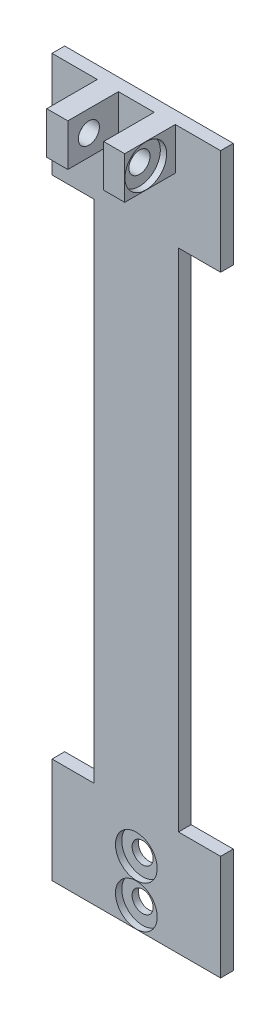
ISO-10303-21;
HEADER;
FILE_DESCRIPTION(('STEP AP214'),'2;1');
FILE_NAME('part.step','',(''),(''),'','','');
FILE_SCHEMA(('AUTOMOTIVE_DESIGN { 1 0 10303 214 1 1 1 1 }'));
ENDSEC;
DATA;
#1=APPLICATION_CONTEXT('core data for automotive mechanical design processes');
#2=APPLICATION_PROTOCOL_DEFINITION('international standard','automotive_design',2000,#1);
#3=PRODUCT_CONTEXT('',#1,'mechanical');
#4=PRODUCT('Part','Part','',(#3));
#5=PRODUCT_RELATED_PRODUCT_CATEGORY('part','',(#4));
#6=PRODUCT_DEFINITION_FORMATION('','',#4);
#7=PRODUCT_DEFINITION_CONTEXT('part definition',#1,'design');
#8=PRODUCT_DEFINITION('design','',#6,#7);
#9=PRODUCT_DEFINITION_SHAPE('','',#8);
#10=(LENGTH_UNIT() NAMED_UNIT(*) SI_UNIT(.MILLI.,.METRE.));
#11=(NAMED_UNIT(*) PLANE_ANGLE_UNIT() SI_UNIT($,.RADIAN.));
#12=(NAMED_UNIT(*) SI_UNIT($,.STERADIAN.) SOLID_ANGLE_UNIT());
#13=UNCERTAINTY_MEASURE_WITH_UNIT(LENGTH_MEASURE(1.E-05),#10,'distance_accuracy_value','');
#14=(GEOMETRIC_REPRESENTATION_CONTEXT(3) GLOBAL_UNCERTAINTY_ASSIGNED_CONTEXT((#13)) GLOBAL_UNIT_ASSIGNED_CONTEXT((#10,
#11,#12)) REPRESENTATION_CONTEXT('',''));
#15=CARTESIAN_POINT('',(0.,0.,0.));
#16=DIRECTION('',(0.,0.,1.));
#17=DIRECTION('',(1.,0.,0.));
#18=AXIS2_PLACEMENT_3D('',#15,#16,#17);
#19=CARTESIAN_POINT('',(0.,0.,3.));
#20=DIRECTION('',(0.,0.,1.));
#21=DIRECTION('',(1.,0.,0.));
#22=AXIS2_PLACEMENT_3D('',#19,#20,#21);
#23=PLANE('',#22);
#24=CARTESIAN_POINT('',(-14.0258823100703,-49.6964705882353,3.));
#25=DIRECTION('',(0.,0.,1.));
#26=DIRECTION('',(1.,0.,0.));
#27=AXIS2_PLACEMENT_3D('',#24,#25,#26);
#28=CIRCLE('',#27,4.95);
#29=CARTESIAN_POINT('',(-9.0758823100703,-49.6964705882353,3.));
#30=VERTEX_POINT('',#29);
#31=EDGE_CURVE('E274',#30,#30,#28,.T.);
#32=ORIENTED_EDGE('',*,*,#31,.F.);
#33=EDGE_LOOP('',(#32));
#34=FACE_BOUND('',#33,.T.);
#35=CARTESIAN_POINT('',(-14.0258823100703,-39.6964705882353,3.));
#36=DIRECTION('',(0.,0.,1.));
#37=DIRECTION('',(1.,0.,0.));
#38=AXIS2_PLACEMENT_3D('',#35,#36,#37);
#39=CIRCLE('',#38,4.95);
#40=CARTESIAN_POINT('',(-9.0758823100703,-39.6964705882353,3.));
#41=VERTEX_POINT('',#40);
#42=EDGE_CURVE('E277',#41,#41,#39,.T.);
#43=ORIENTED_EDGE('',*,*,#42,.F.);
#44=EDGE_LOOP('',(#43));
#45=FACE_BOUND('',#44,.T.);
#46=DIRECTION('',(1.,0.,0.));
#47=VECTOR('',#46,1.);
#48=CARTESIAN_POINT('',(0.,115.303529411765,3.));
#49=LINE('',#48,#47);
#50=CARTESIAN_POINT('',(-18.2758823100703,115.303529411765,3.));
#51=VERTEX_POINT('',#50);
#52=CARTESIAN_POINT('',(-9.7758823100703,115.303529411765,3.));
#53=VERTEX_POINT('',#52);
#54=EDGE_CURVE('E55',#51,#53,#49,.T.);
#55=ORIENTED_EDGE('',*,*,#54,.F.);
#56=DIRECTION('',(0.,-1.,0.));
#57=VECTOR('',#56,1.);
#58=CARTESIAN_POINT('',(-18.2758823100703,0.,3.));
#59=LINE('',#58,#57);
#60=CARTESIAN_POINT('',(-18.2758823100703,105.303529411765,3.));
#61=VERTEX_POINT('',#60);
#62=EDGE_CURVE('E200',#51,#61,#59,.T.);
#63=ORIENTED_EDGE('',*,*,#62,.T.);
#64=DIRECTION('',(1.,0.,0.));
#65=VECTOR('',#64,1.);
#66=CARTESIAN_POINT('',(0.,105.303529411765,3.));
#67=LINE('',#66,#65);
#68=CARTESIAN_POINT('',(-23.2758823100703,105.303529411765,3.));
#69=VERTEX_POINT('',#68);
#70=EDGE_CURVE('E49',#69,#61,#67,.T.);
#71=ORIENTED_EDGE('',*,*,#70,.F.);
#72=DIRECTION('',(0.,-1.,0.));
#73=VECTOR('',#72,1.);
#74=CARTESIAN_POINT('',(-23.2758823100703,0.,3.));
#75=LINE('',#74,#73);
#76=CARTESIAN_POINT('',(-23.2758823100703,115.303529411765,3.));
#77=VERTEX_POINT('',#76);
#78=EDGE_CURVE('E198',#77,#69,#75,.T.);
#79=ORIENTED_EDGE('',*,*,#78,.F.);
#80=CARTESIAN_POINT('',(-34.0258823100703,115.303529411765,3.));
#81=VERTEX_POINT('',#80);
#82=EDGE_CURVE('E251',#81,#77,#49,.T.);
#83=ORIENTED_EDGE('',*,*,#82,.F.);
#84=DIRECTION('',(0.,-1.,0.));
#85=VECTOR('',#84,1.);
#86=CARTESIAN_POINT('',(-34.0258823100703,0.,3.));
#87=LINE('',#86,#85);
#88=CARTESIAN_POINT('',(-34.0258823100703,90.3035294117647,3.));
#89=VERTEX_POINT('',#88);
#90=EDGE_CURVE('E254',#81,#89,#87,.T.);
#91=ORIENTED_EDGE('',*,*,#90,.T.);
#92=DIRECTION('',(1.,0.,0.));
#93=VECTOR('',#92,1.);
#94=CARTESIAN_POINT('',(0.,90.3035294117647,3.));
#95=LINE('',#94,#93);
#96=CARTESIAN_POINT('',(-24.0258823100703,90.3035294117647,3.));
#97=VERTEX_POINT('',#96);
#98=EDGE_CURVE('E256',#89,#97,#95,.T.);
#99=ORIENTED_EDGE('',*,*,#98,.T.);
#100=DIRECTION('',(0.,-1.,0.));
#101=VECTOR('',#100,1.);
#102=CARTESIAN_POINT('',(-24.0258823100703,0.,3.));
#103=LINE('',#102,#101);
#104=CARTESIAN_POINT('',(-24.0258823100703,-29.6964705882353,3.));
#105=VERTEX_POINT('',#104);
#106=EDGE_CURVE('E259',#97,#105,#103,.T.);
#107=ORIENTED_EDGE('',*,*,#106,.T.);
#108=DIRECTION('',(1.,0.,0.));
#109=VECTOR('',#108,1.);
#110=CARTESIAN_POINT('',(0.,-29.6964705882353,3.));
#111=LINE('',#110,#109);
#112=CARTESIAN_POINT('',(-34.0258823100703,-29.6964705882353,3.));
#113=VERTEX_POINT('',#112);
#114=EDGE_CURVE('E261',#113,#105,#111,.T.);
#115=ORIENTED_EDGE('',*,*,#114,.F.);
#116=CARTESIAN_POINT('',(-34.0258823100703,-54.6964705882353,3.));
#117=VERTEX_POINT('',#116);
#118=EDGE_CURVE('E257',#113,#117,#87,.T.);
#119=ORIENTED_EDGE('',*,*,#118,.T.);
#120=DIRECTION('',(1.,0.,0.));
#121=VECTOR('',#120,1.);
#122=CARTESIAN_POINT('',(0.,-54.6964705882353,3.));
#123=LINE('',#122,#121);
#124=CARTESIAN_POINT('',(5.97411768992969,-54.6964705882353,3.));
#125=VERTEX_POINT('',#124);
#126=EDGE_CURVE('E264',#117,#125,#123,.T.);
#127=ORIENTED_EDGE('',*,*,#126,.T.);
#128=DIRECTION('',(0.,-1.,0.));
#129=VECTOR('',#128,1.);
#130=CARTESIAN_POINT('',(5.97411768992969,0.,3.));
#131=LINE('',#130,#129);
#132=CARTESIAN_POINT('',(5.97411768992969,-29.6964705882353,3.));
#133=VERTEX_POINT('',#132);
#134=EDGE_CURVE('E250',#133,#125,#131,.T.);
#135=ORIENTED_EDGE('',*,*,#134,.F.);
#136=DIRECTION('',(-1.,0.,0.));
#137=VECTOR('',#136,1.);
#138=CARTESIAN_POINT('',(0.,-29.6964705882353,3.));
#139=LINE('',#138,#137);
#140=CARTESIAN_POINT('',(-4.02588231007028,-29.6964705882353,3.));
#141=VERTEX_POINT('',#140);
#142=EDGE_CURVE('E266',#133,#141,#139,.T.);
#143=ORIENTED_EDGE('',*,*,#142,.T.);
#144=DIRECTION('',(0.,-1.,0.));
#145=VECTOR('',#144,1.);
#146=CARTESIAN_POINT('',(-4.02588231007028,0.,3.));
#147=LINE('',#146,#145);
#148=CARTESIAN_POINT('',(-4.0258823100703,90.3035294117647,3.));
#149=VERTEX_POINT('',#148);
#150=EDGE_CURVE('E268',#149,#141,#147,.T.);
#151=ORIENTED_EDGE('',*,*,#150,.F.);
#152=DIRECTION('',(-1.,0.,0.));
#153=VECTOR('',#152,1.);
#154=CARTESIAN_POINT('',(0.,90.3035294117647,3.));
#155=LINE('',#154,#153);
#156=CARTESIAN_POINT('',(5.9741176899297,90.3035294117647,3.));
#157=VERTEX_POINT('',#156);
#158=EDGE_CURVE('E271',#157,#149,#155,.T.);
#159=ORIENTED_EDGE('',*,*,#158,.F.);
#160=CARTESIAN_POINT('',(5.9741176899297,115.303529411765,3.));
#161=VERTEX_POINT('',#160);
#162=EDGE_CURVE('E245',#161,#157,#131,.T.);
#163=ORIENTED_EDGE('',*,*,#162,.F.);
#164=CARTESIAN_POINT('',(-4.7758823100703,115.303529411765,3.));
#165=VERTEX_POINT('',#164);
#166=EDGE_CURVE('E248',#165,#161,#49,.T.);
#167=ORIENTED_EDGE('',*,*,#166,.F.);
#168=DIRECTION('',(0.,-1.,0.));
#169=VECTOR('',#168,1.);
#170=CARTESIAN_POINT('',(-4.7758823100703,0.,3.));
#171=LINE('',#170,#169);
#172=CARTESIAN_POINT('',(-4.7758823100703,105.303529411765,3.));
#173=VERTEX_POINT('',#172);
#174=EDGE_CURVE('E226',#165,#173,#171,.T.);
#175=ORIENTED_EDGE('',*,*,#174,.T.);
#176=DIRECTION('',(-1.,0.,0.));
#177=VECTOR('',#176,1.);
#178=CARTESIAN_POINT('',(0.,105.303529411765,3.));
#179=LINE('',#178,#177);
#180=CARTESIAN_POINT('',(-9.7758823100703,105.303529411765,3.));
#181=VERTEX_POINT('',#180);
#182=EDGE_CURVE('E229',#173,#181,#179,.T.);
#183=ORIENTED_EDGE('',*,*,#182,.T.);
#184=DIRECTION('',(0.,1.,0.));
#185=VECTOR('',#184,1.);
#186=CARTESIAN_POINT('',(-9.7758823100703,0.,3.));
#187=LINE('',#186,#185);
#188=EDGE_CURVE('E224',#181,#53,#187,.T.);
#189=ORIENTED_EDGE('',*,*,#188,.T.);
#190=EDGE_LOOP('',(#55,#63,#71,#79,#83,#91,#99,#107,#115,#119,#127,#135,#143,#151,#159,#163,
#167,#175,#183,#189));
#191=FACE_BOUND('',#190,.T.);
#192=ADVANCED_FACE('F34',(#34,#45,#191),#23,.T.);
#193=CARTESIAN_POINT('',(5.97411768992969,0.,3.));
#194=DIRECTION('',(1.,0.,0.));
#195=DIRECTION('',(0.,1.,0.));
#196=AXIS2_PLACEMENT_3D('',#193,#194,#195);
#197=PLANE('',#196);
#198=DIRECTION('',(0.,-1.,0.));
#199=VECTOR('',#198,1.);
#200=CARTESIAN_POINT('',(5.97411768992969,0.,0.));
#201=LINE('',#200,#199);
#202=CARTESIAN_POINT('',(5.9741176899297,115.303529411765,0.));
#203=VERTEX_POINT('',#202);
#204=CARTESIAN_POINT('',(5.9741176899297,90.3035294117647,0.));
#205=VERTEX_POINT('',#204);
#206=EDGE_CURVE('E242',#203,#205,#201,.T.);
#207=ORIENTED_EDGE('',*,*,#206,.F.);
#208=DIRECTION('',(0.,0.,-1.));
#209=VECTOR('',#208,1.);
#210=CARTESIAN_POINT('',(5.9741176899297,115.303529411765,3.));
#211=LINE('',#210,#209);
#212=EDGE_CURVE('E332',#161,#203,#211,.T.);
#213=ORIENTED_EDGE('',*,*,#212,.F.);
#214=ORIENTED_EDGE('',*,*,#162,.T.);
#215=DIRECTION('',(0.,0.,-1.));
#216=VECTOR('',#215,1.);
#217=CARTESIAN_POINT('',(5.9741176899297,90.3035294117647,3.));
#218=LINE('',#217,#216);
#219=EDGE_CURVE('E280',#157,#205,#218,.T.);
#220=ORIENTED_EDGE('',*,*,#219,.T.);
#221=EDGE_LOOP('',(#207,#213,#214,#220));
#222=FACE_BOUND('',#221,.T.);
#223=ADVANCED_FACE('F348',(#222),#197,.T.);
#224=CARTESIAN_POINT('',(0.,115.303529411765,3.));
#225=DIRECTION('',(0.,1.,0.));
#226=DIRECTION('',(0.,0.,1.));
#227=AXIS2_PLACEMENT_3D('',#224,#225,#226);
#228=PLANE('',#227);
#229=ORIENTED_EDGE('',*,*,#82,.T.);
#230=DIRECTION('',(0.,0.,-1.));
#231=VECTOR('',#230,1.);
#232=CARTESIAN_POINT('',(-23.2758823100703,115.303529411765,15.));
#233=LINE('',#232,#231);
#234=CARTESIAN_POINT('',(-23.2758823100703,115.303529411765,15.));
#235=VERTEX_POINT('',#234);
#236=EDGE_CURVE('E744',#235,#77,#233,.T.);
#237=ORIENTED_EDGE('',*,*,#236,.F.);
#238=DIRECTION('',(-1.,0.,0.));
#239=VECTOR('',#238,1.);
#240=CARTESIAN_POINT('',(-18.2758823100703,115.303529411765,15.));
#241=LINE('',#240,#239);
#242=CARTESIAN_POINT('',(-18.2758823100703,115.303529411765,15.));
#243=VERTEX_POINT('',#242);
#244=EDGE_CURVE('E186',#243,#235,#241,.T.);
#245=ORIENTED_EDGE('',*,*,#244,.F.);
#246=DIRECTION('',(0.,0.,-1.));
#247=VECTOR('',#246,1.);
#248=CARTESIAN_POINT('',(-18.2758823100703,115.303529411765,15.));
#249=LINE('',#248,#247);
#250=EDGE_CURVE('E184',#243,#51,#249,.T.);
#251=ORIENTED_EDGE('',*,*,#250,.T.);
#252=ORIENTED_EDGE('',*,*,#54,.T.);
#253=DIRECTION('',(0.,0.,-1.));
#254=VECTOR('',#253,1.);
#255=CARTESIAN_POINT('',(-9.7758823100703,115.303529411765,15.));
#256=LINE('',#255,#254);
#257=CARTESIAN_POINT('',(-9.7758823100703,115.303529411765,15.));
#258=VERTEX_POINT('',#257);
#259=EDGE_CURVE('E215',#258,#53,#256,.T.);
#260=ORIENTED_EDGE('',*,*,#259,.F.);
#261=DIRECTION('',(1.,0.,0.));
#262=VECTOR('',#261,1.);
#263=CARTESIAN_POINT('',(0.,115.303529411765,15.));
#264=LINE('',#263,#262);
#265=CARTESIAN_POINT('',(-4.7758823100703,115.303529411765,15.));
#266=VERTEX_POINT('',#265);
#267=EDGE_CURVE('E207',#258,#266,#264,.T.);
#268=ORIENTED_EDGE('',*,*,#267,.T.);
#269=DIRECTION('',(0.,0.,-1.));
#270=VECTOR('',#269,1.);
#271=CARTESIAN_POINT('',(-4.7758823100703,115.303529411765,15.));
#272=LINE('',#271,#270);
#273=EDGE_CURVE('E218',#266,#165,#272,.T.);
#274=ORIENTED_EDGE('',*,*,#273,.T.);
#275=ORIENTED_EDGE('',*,*,#166,.T.);
#276=ORIENTED_EDGE('',*,*,#212,.T.);
#277=DIRECTION('',(1.,0.,0.));
#278=VECTOR('',#277,1.);
#279=CARTESIAN_POINT('',(0.,115.303529411765,0.));
#280=LINE('',#279,#278);
#281=CARTESIAN_POINT('',(-34.0258823100703,115.303529411765,0.));
#282=VERTEX_POINT('',#281);
#283=EDGE_CURVE('E283',#282,#203,#280,.T.);
#284=ORIENTED_EDGE('',*,*,#283,.F.);
#285=DIRECTION('',(0.,0.,-1.));
#286=VECTOR('',#285,1.);
#287=CARTESIAN_POINT('',(-34.0258823100703,115.303529411765,3.));
#288=LINE('',#287,#286);
#289=EDGE_CURVE('E330',#81,#282,#288,.T.);
#290=ORIENTED_EDGE('',*,*,#289,.F.);
#291=EDGE_LOOP('',(#229,#237,#245,#251,#252,#260,#268,#274,#275,#276,#284,#290));
#292=FACE_BOUND('',#291,.T.);
#293=ADVANCED_FACE('F36',(#292),#228,.T.);
#294=CARTESIAN_POINT('',(-34.0258823100703,0.,3.));
#295=DIRECTION('',(1.,0.,0.));
#296=DIRECTION('',(0.,1.,0.));
#297=AXIS2_PLACEMENT_3D('',#294,#295,#296);
#298=PLANE('',#297);
#299=DIRECTION('',(0.,-1.,0.));
#300=VECTOR('',#299,1.);
#301=CARTESIAN_POINT('',(-34.0258823100703,0.,0.));
#302=LINE('',#301,#300);
#303=CARTESIAN_POINT('',(-34.0258823100703,90.3035294117647,0.));
#304=VERTEX_POINT('',#303);
#305=EDGE_CURVE('E286',#282,#304,#302,.T.);
#306=ORIENTED_EDGE('',*,*,#305,.T.);
#307=DIRECTION('',(0.,0.,-1.));
#308=VECTOR('',#307,1.);
#309=CARTESIAN_POINT('',(-34.0258823100703,90.3035294117647,3.));
#310=LINE('',#309,#308);
#311=EDGE_CURVE('E327',#89,#304,#310,.T.);
#312=ORIENTED_EDGE('',*,*,#311,.F.);
#313=ORIENTED_EDGE('',*,*,#90,.F.);
#314=ORIENTED_EDGE('',*,*,#289,.T.);
#315=EDGE_LOOP('',(#306,#312,#313,#314));
#316=FACE_BOUND('',#315,.T.);
#317=ADVANCED_FACE('F391',(#316),#298,.F.);
#318=CARTESIAN_POINT('',(0.,90.3035294117647,3.));
#319=DIRECTION('',(0.,1.,0.));
#320=DIRECTION('',(0.,0.,1.));
#321=AXIS2_PLACEMENT_3D('',#318,#319,#320);
#322=PLANE('',#321);
#323=DIRECTION('',(1.,0.,0.));
#324=VECTOR('',#323,1.);
#325=CARTESIAN_POINT('',(0.,90.3035294117647,0.));
#326=LINE('',#325,#324);
#327=CARTESIAN_POINT('',(-24.0258823100703,90.3035294117647,0.));
#328=VERTEX_POINT('',#327);
#329=EDGE_CURVE('E288',#304,#328,#326,.T.);
#330=ORIENTED_EDGE('',*,*,#329,.T.);
#331=DIRECTION('',(0.,0.,-1.));
#332=VECTOR('',#331,1.);
#333=CARTESIAN_POINT('',(-24.0258823100703,90.3035294117647,3.));
#334=LINE('',#333,#332);
#335=EDGE_CURVE('E324',#97,#328,#334,.T.);
#336=ORIENTED_EDGE('',*,*,#335,.F.);
#337=ORIENTED_EDGE('',*,*,#98,.F.);
#338=ORIENTED_EDGE('',*,*,#311,.T.);
#339=EDGE_LOOP('',(#330,#336,#337,#338));
#340=FACE_BOUND('',#339,.T.);
#341=ADVANCED_FACE('F397',(#340),#322,.F.);
#342=CARTESIAN_POINT('',(-24.0258823100703,0.,3.));
#343=DIRECTION('',(1.,0.,0.));
#344=DIRECTION('',(0.,1.,0.));
#345=AXIS2_PLACEMENT_3D('',#342,#343,#344);
#346=PLANE('',#345);
#347=DIRECTION('',(0.,-1.,0.));
#348=VECTOR('',#347,1.);
#349=CARTESIAN_POINT('',(-24.0258823100703,0.,0.));
#350=LINE('',#349,#348);
#351=CARTESIAN_POINT('',(-24.0258823100703,-29.6964705882353,0.));
#352=VERTEX_POINT('',#351);
#353=EDGE_CURVE('E291',#328,#352,#350,.T.);
#354=ORIENTED_EDGE('',*,*,#353,.T.);
#355=DIRECTION('',(0.,0.,-1.));
#356=VECTOR('',#355,1.);
#357=CARTESIAN_POINT('',(-24.0258823100703,-29.6964705882353,3.));
#358=LINE('',#357,#356);
#359=EDGE_CURVE('E322',#105,#352,#358,.T.);
#360=ORIENTED_EDGE('',*,*,#359,.F.);
#361=ORIENTED_EDGE('',*,*,#106,.F.);
#362=ORIENTED_EDGE('',*,*,#335,.T.);
#363=EDGE_LOOP('',(#354,#360,#361,#362));
#364=FACE_BOUND('',#363,.T.);
#365=ADVANCED_FACE('F394',(#364),#346,.F.);
#366=CARTESIAN_POINT('',(0.,-29.6964705882353,3.));
#367=DIRECTION('',(0.,1.,0.));
#368=DIRECTION('',(-1.,0.,0.));
#369=AXIS2_PLACEMENT_3D('',#366,#367,#368);
#370=PLANE('',#369);
#371=DIRECTION('',(1.,0.,0.));
#372=VECTOR('',#371,1.);
#373=CARTESIAN_POINT('',(0.,-29.6964705882353,0.));
#374=LINE('',#373,#372);
#375=CARTESIAN_POINT('',(-34.0258823100703,-29.6964705882353,0.));
#376=VERTEX_POINT('',#375);
#377=EDGE_CURVE('E294',#376,#352,#374,.T.);
#378=ORIENTED_EDGE('',*,*,#377,.F.);
#379=DIRECTION('',(0.,0.,-1.));
#380=VECTOR('',#379,1.);
#381=CARTESIAN_POINT('',(-34.0258823100703,-29.6964705882353,3.));
#382=LINE('',#381,#380);
#383=EDGE_CURVE('E320',#113,#376,#382,.T.);
#384=ORIENTED_EDGE('',*,*,#383,.F.);
#385=ORIENTED_EDGE('',*,*,#114,.T.);
#386=ORIENTED_EDGE('',*,*,#359,.T.);
#387=EDGE_LOOP('',(#378,#384,#385,#386));
#388=FACE_BOUND('',#387,.T.);
#389=ADVANCED_FACE('F389',(#388),#370,.T.);
#390=CARTESIAN_POINT('',(-34.0258823100703,-54.6964705882353,0.));
#391=VERTEX_POINT('',#390);
#392=EDGE_CURVE('E289',#376,#391,#302,.T.);
#393=ORIENTED_EDGE('',*,*,#392,.T.);
#394=DIRECTION('',(0.,0.,-1.));
#395=VECTOR('',#394,1.);
#396=CARTESIAN_POINT('',(-34.0258823100703,-54.6964705882353,3.));
#397=LINE('',#396,#395);
#398=EDGE_CURVE('E317',#117,#391,#397,.T.);
#399=ORIENTED_EDGE('',*,*,#398,.F.);
#400=ORIENTED_EDGE('',*,*,#118,.F.);
#401=ORIENTED_EDGE('',*,*,#383,.T.);
#402=EDGE_LOOP('',(#393,#399,#400,#401));
#403=FACE_BOUND('',#402,.T.);
#404=ADVANCED_FACE('F385',(#403),#298,.F.);
#405=CARTESIAN_POINT('',(0.,-54.6964705882353,3.));
#406=DIRECTION('',(0.,1.,0.));
#407=DIRECTION('',(0.,0.,1.));
#408=AXIS2_PLACEMENT_3D('',#405,#406,#407);
#409=PLANE('',#408);
#410=DIRECTION('',(1.,0.,0.));
#411=VECTOR('',#410,1.);
#412=CARTESIAN_POINT('',(0.,-54.6964705882353,0.));
#413=LINE('',#412,#411);
#414=CARTESIAN_POINT('',(5.97411768992969,-54.6964705882353,0.));
#415=VERTEX_POINT('',#414);
#416=EDGE_CURVE('E297',#391,#415,#413,.T.);
#417=ORIENTED_EDGE('',*,*,#416,.T.);
#418=DIRECTION('',(0.,0.,-1.));
#419=VECTOR('',#418,1.);
#420=CARTESIAN_POINT('',(5.97411768992969,-54.6964705882353,3.));
#421=LINE('',#420,#419);
#422=EDGE_CURVE('E315',#125,#415,#421,.T.);
#423=ORIENTED_EDGE('',*,*,#422,.F.);
#424=ORIENTED_EDGE('',*,*,#126,.F.);
#425=ORIENTED_EDGE('',*,*,#398,.T.);
#426=EDGE_LOOP('',(#417,#423,#424,#425));
#427=FACE_BOUND('',#426,.T.);
#428=ADVANCED_FACE('F381',(#427),#409,.F.);
#429=CARTESIAN_POINT('',(5.97411768992969,-29.6964705882353,0.));
#430=VERTEX_POINT('',#429);
#431=EDGE_CURVE('E284',#430,#415,#201,.T.);
#432=ORIENTED_EDGE('',*,*,#431,.F.);
#433=DIRECTION('',(0.,0.,-1.));
#434=VECTOR('',#433,1.);
#435=CARTESIAN_POINT('',(5.97411768992969,-29.6964705882353,3.));
#436=LINE('',#435,#434);
#437=EDGE_CURVE('E313',#133,#430,#436,.T.);
#438=ORIENTED_EDGE('',*,*,#437,.F.);
#439=ORIENTED_EDGE('',*,*,#134,.T.);
#440=ORIENTED_EDGE('',*,*,#422,.T.);
#441=EDGE_LOOP('',(#432,#438,#439,#440));
#442=FACE_BOUND('',#441,.T.);
#443=ADVANCED_FACE('F356',(#442),#197,.T.);
#444=CARTESIAN_POINT('',(0.,-29.6964705882353,3.));
#445=DIRECTION('',(0.,-1.,0.));
#446=DIRECTION('',(1.,0.,0.));
#447=AXIS2_PLACEMENT_3D('',#444,#445,#446);
#448=PLANE('',#447);
#449=DIRECTION('',(-1.,0.,0.));
#450=VECTOR('',#449,1.);
#451=CARTESIAN_POINT('',(0.,-29.6964705882353,0.));
#452=LINE('',#451,#450);
#453=CARTESIAN_POINT('',(-4.02588231007028,-29.6964705882353,0.));
#454=VERTEX_POINT('',#453);
#455=EDGE_CURVE('E300',#430,#454,#452,.T.);
#456=ORIENTED_EDGE('',*,*,#455,.T.);
#457=DIRECTION('',(0.,0.,-1.));
#458=VECTOR('',#457,1.);
#459=CARTESIAN_POINT('',(-4.02588231007028,-29.6964705882353,3.));
#460=LINE('',#459,#458);
#461=EDGE_CURVE('E311',#141,#454,#460,.T.);
#462=ORIENTED_EDGE('',*,*,#461,.F.);
#463=ORIENTED_EDGE('',*,*,#142,.F.);
#464=ORIENTED_EDGE('',*,*,#437,.T.);
#465=EDGE_LOOP('',(#456,#462,#463,#464));
#466=FACE_BOUND('',#465,.T.);
#467=ADVANCED_FACE('F375',(#466),#448,.F.);
#468=CARTESIAN_POINT('',(-4.02588231007028,0.,3.));
#469=DIRECTION('',(1.,0.,0.));
#470=DIRECTION('',(0.,1.,0.));
#471=AXIS2_PLACEMENT_3D('',#468,#469,#470);
#472=PLANE('',#471);
#473=DIRECTION('',(0.,-1.,0.));
#474=VECTOR('',#473,1.);
#475=CARTESIAN_POINT('',(-4.02588231007028,0.,0.));
#476=LINE('',#475,#474);
#477=CARTESIAN_POINT('',(-4.0258823100703,90.3035294117647,0.));
#478=VERTEX_POINT('',#477);
#479=EDGE_CURVE('E303',#478,#454,#476,.T.);
#480=ORIENTED_EDGE('',*,*,#479,.F.);
#481=DIRECTION('',(0.,0.,-1.));
#482=VECTOR('',#481,1.);
#483=CARTESIAN_POINT('',(-4.0258823100703,90.3035294117647,3.));
#484=LINE('',#483,#482);
#485=EDGE_CURVE('E309',#149,#478,#484,.T.);
#486=ORIENTED_EDGE('',*,*,#485,.F.);
#487=ORIENTED_EDGE('',*,*,#150,.T.);
#488=ORIENTED_EDGE('',*,*,#461,.T.);
#489=EDGE_LOOP('',(#480,#486,#487,#488));
#490=FACE_BOUND('',#489,.T.);
#491=ADVANCED_FACE('F368',(#490),#472,.T.);
#492=CARTESIAN_POINT('',(-14.0258823100703,-49.6964705882353,3.));
#493=DIRECTION('',(0.,0.,-1.));
#494=DIRECTION('',(-1.,0.,0.));
#495=AXIS2_PLACEMENT_3D('',#492,#493,#494);
#496=CYLINDRICAL_SURFACE('',#495,4.95);
#497=CARTESIAN_POINT('',(-14.0258823100703,-49.6964705882353,1.5));
#498=DIRECTION('',(0.,0.,1.));
#499=DIRECTION('',(1.,0.,0.));
#500=AXIS2_PLACEMENT_3D('',#497,#498,#499);
#501=CIRCLE('',#500,4.95);
#502=CARTESIAN_POINT('',(-9.0758823100703,-49.6964705882353,1.5));
#503=VERTEX_POINT('',#502);
#504=EDGE_CURVE('E11',#503,#503,#501,.T.);
#505=ORIENTED_EDGE('',*,*,#504,.F.);
#506=EDGE_LOOP('',(#505));
#507=FACE_BOUND('',#506,.T.);
#508=ORIENTED_EDGE('',*,*,#31,.T.);
#509=EDGE_LOOP('',(#508));
#510=FACE_BOUND('',#509,.T.);
#511=ADVANCED_FACE('F365',(#507,#510),#496,.F.);
#512=CARTESIAN_POINT('',(0.,90.3035294117647,3.));
#513=DIRECTION('',(0.,-1.,0.));
#514=DIRECTION('',(0.,0.,-1.));
#515=AXIS2_PLACEMENT_3D('',#512,#513,#514);
#516=PLANE('',#515);
#517=DIRECTION('',(-1.,0.,0.));
#518=VECTOR('',#517,1.);
#519=CARTESIAN_POINT('',(0.,90.3035294117647,0.));
#520=LINE('',#519,#518);
#521=EDGE_CURVE('E249',#205,#478,#520,.T.);
#522=ORIENTED_EDGE('',*,*,#521,.F.);
#523=ORIENTED_EDGE('',*,*,#219,.F.);
#524=ORIENTED_EDGE('',*,*,#158,.T.);
#525=ORIENTED_EDGE('',*,*,#485,.T.);
#526=EDGE_LOOP('',(#522,#523,#524,#525));
#527=FACE_BOUND('',#526,.T.);
#528=ADVANCED_FACE('F343',(#527),#516,.T.);
#529=CARTESIAN_POINT('',(-14.0258823100703,-39.6964705882353,3.));
#530=DIRECTION('',(0.,0.,-1.));
#531=DIRECTION('',(-1.,0.,0.));
#532=AXIS2_PLACEMENT_3D('',#529,#530,#531);
#533=CYLINDRICAL_SURFACE('',#532,4.95);
#534=CARTESIAN_POINT('',(-14.0258823100703,-39.6964705882353,1.5));
#535=DIRECTION('',(0.,0.,1.));
#536=DIRECTION('',(1.,0.,0.));
#537=AXIS2_PLACEMENT_3D('',#534,#535,#536);
#538=CIRCLE('',#537,4.95);
#539=CARTESIAN_POINT('',(-9.0758823100703,-39.6964705882353,1.5));
#540=VERTEX_POINT('',#539);
#541=EDGE_CURVE('E42',#540,#540,#538,.T.);
#542=ORIENTED_EDGE('',*,*,#541,.F.);
#543=EDGE_LOOP('',(#542));
#544=FACE_BOUND('',#543,.T.);
#545=ORIENTED_EDGE('',*,*,#42,.T.);
#546=EDGE_LOOP('',(#545));
#547=FACE_BOUND('',#546,.T.);
#548=ADVANCED_FACE('F339',(#544,#547),#533,.F.);
#549=CARTESIAN_POINT('',(0.,0.,0.));
#550=DIRECTION('',(0.,0.,1.));
#551=DIRECTION('',(1.,0.,0.));
#552=AXIS2_PLACEMENT_3D('',#549,#550,#551);
#553=PLANE('',#552);
#554=ORIENTED_EDGE('',*,*,#283,.T.);
#555=ORIENTED_EDGE('',*,*,#206,.T.);
#556=ORIENTED_EDGE('',*,*,#521,.T.);
#557=ORIENTED_EDGE('',*,*,#479,.T.);
#558=ORIENTED_EDGE('',*,*,#455,.F.);
#559=ORIENTED_EDGE('',*,*,#431,.T.);
#560=ORIENTED_EDGE('',*,*,#416,.F.);
#561=ORIENTED_EDGE('',*,*,#392,.F.);
#562=ORIENTED_EDGE('',*,*,#377,.T.);
#563=ORIENTED_EDGE('',*,*,#353,.F.);
#564=ORIENTED_EDGE('',*,*,#329,.F.);
#565=ORIENTED_EDGE('',*,*,#305,.F.);
#566=EDGE_LOOP('',(#554,#555,#556,#557,#558,#559,#560,#561,#562,#563,#564,#565));
#567=FACE_BOUND('',#566,.T.);
#568=CARTESIAN_POINT('',(-14.0258823100703,-39.6964705882353,0.));
#569=DIRECTION('',(0.,0.,1.));
#570=DIRECTION('',(1.,0.,0.));
#571=AXIS2_PLACEMENT_3D('',#568,#569,#570);
#572=CIRCLE('',#571,2.5);
#573=CARTESIAN_POINT('',(-11.5258823100703,-39.6964705882353,0.));
#574=VERTEX_POINT('',#573);
#575=EDGE_CURVE('E236',#574,#574,#572,.T.);
#576=ORIENTED_EDGE('',*,*,#575,.T.);
#577=EDGE_LOOP('',(#576));
#578=FACE_BOUND('',#577,.T.);
#579=CARTESIAN_POINT('',(-14.0258823100703,-49.6964705882353,0.));
#580=DIRECTION('',(0.,0.,1.));
#581=DIRECTION('',(1.,0.,0.));
#582=AXIS2_PLACEMENT_3D('',#579,#580,#581);
#583=CIRCLE('',#582,2.5);
#584=CARTESIAN_POINT('',(-11.5258823100703,-49.6964705882353,0.));
#585=VERTEX_POINT('',#584);
#586=EDGE_CURVE('E232',#585,#585,#583,.T.);
#587=ORIENTED_EDGE('',*,*,#586,.T.);
#588=EDGE_LOOP('',(#587));
#589=FACE_BOUND('',#588,.T.);
#590=ADVANCED_FACE('F342',(#567,#578,#589),#553,.F.);
#591=CARTESIAN_POINT('',(-14.0258823100703,-39.6964705882353,1.5));
#592=DIRECTION('',(0.,0.,-1.));
#593=DIRECTION('',(-1.,0.,0.));
#594=AXIS2_PLACEMENT_3D('',#591,#592,#593);
#595=CYLINDRICAL_SURFACE('',#594,2.5);
#596=CARTESIAN_POINT('',(-14.0258823100703,-39.6964705882353,1.5));
#597=DIRECTION('',(0.,0.,1.));
#598=DIRECTION('',(1.,0.,0.));
#599=AXIS2_PLACEMENT_3D('',#596,#597,#598);
#600=CIRCLE('',#599,2.5);
#601=CARTESIAN_POINT('',(-11.5258823100703,-39.6964705882353,1.5));
#602=VERTEX_POINT('',#601);
#603=EDGE_CURVE('E239',#602,#602,#600,.T.);
#604=ORIENTED_EDGE('',*,*,#603,.T.);
#605=EDGE_LOOP('',(#604));
#606=FACE_BOUND('',#605,.T.);
#607=ORIENTED_EDGE('',*,*,#575,.F.);
#608=EDGE_LOOP('',(#607));
#609=FACE_BOUND('',#608,.T.);
#610=ADVANCED_FACE('F360',(#606,#609),#595,.F.);
#611=CARTESIAN_POINT('',(0.,0.,1.5));
#612=DIRECTION('',(0.,0.,1.));
#613=DIRECTION('',(1.,0.,0.));
#614=AXIS2_PLACEMENT_3D('',#611,#612,#613);
#615=PLANE('',#614);
#616=ORIENTED_EDGE('',*,*,#603,.F.);
#617=EDGE_LOOP('',(#616));
#618=FACE_BOUND('',#617,.T.);
#619=ORIENTED_EDGE('',*,*,#541,.T.);
#620=EDGE_LOOP('',(#619));
#621=FACE_BOUND('',#620,.T.);
#622=ADVANCED_FACE('F337',(#618,#621),#615,.T.);
#623=CARTESIAN_POINT('',(-14.0258823100703,-49.6964705882353,1.5));
#624=DIRECTION('',(0.,0.,-1.));
#625=DIRECTION('',(-1.,0.,0.));
#626=AXIS2_PLACEMENT_3D('',#623,#624,#625);
#627=CYLINDRICAL_SURFACE('',#626,2.5);
#628=CARTESIAN_POINT('',(-14.0258823100703,-49.6964705882353,1.5));
#629=DIRECTION('',(0.,0.,1.));
#630=DIRECTION('',(1.,0.,0.));
#631=AXIS2_PLACEMENT_3D('',#628,#629,#630);
#632=CIRCLE('',#631,2.5);
#633=CARTESIAN_POINT('',(-11.5258823100703,-49.6964705882353,1.5));
#634=VERTEX_POINT('',#633);
#635=EDGE_CURVE('E233',#634,#634,#632,.T.);
#636=ORIENTED_EDGE('',*,*,#635,.T.);
#637=EDGE_LOOP('',(#636));
#638=FACE_BOUND('',#637,.T.);
#639=ORIENTED_EDGE('',*,*,#586,.F.);
#640=EDGE_LOOP('',(#639));
#641=FACE_BOUND('',#640,.T.);
#642=ADVANCED_FACE('F477',(#638,#641),#627,.F.);
#643=CARTESIAN_POINT('',(0.,0.,1.5));
#644=DIRECTION('',(0.,0.,1.));
#645=DIRECTION('',(1.,0.,0.));
#646=AXIS2_PLACEMENT_3D('',#643,#644,#645);
#647=PLANE('',#646);
#648=ORIENTED_EDGE('',*,*,#635,.F.);
#649=EDGE_LOOP('',(#648));
#650=FACE_BOUND('',#649,.T.);
#651=ORIENTED_EDGE('',*,*,#504,.T.);
#652=EDGE_LOOP('',(#651));
#653=FACE_BOUND('',#652,.T.);
#654=ADVANCED_FACE('F474',(#650,#653),#647,.T.);
#655=CARTESIAN_POINT('',(0.,105.303529411765,15.));
#656=DIRECTION('',(0.,1.,0.));
#657=DIRECTION('',(0.,0.,1.));
#658=AXIS2_PLACEMENT_3D('',#655,#656,#657);
#659=PLANE('',#658);
#660=ORIENTED_EDGE('',*,*,#182,.F.);
#661=DIRECTION('',(0.,0.,-1.));
#662=VECTOR('',#661,1.);
#663=CARTESIAN_POINT('',(-4.7758823100703,105.303529411765,15.));
#664=LINE('',#663,#662);
#665=CARTESIAN_POINT('',(-4.7758823100703,105.303529411765,15.));
#666=VERTEX_POINT('',#665);
#667=EDGE_CURVE('E221',#666,#173,#664,.T.);
#668=ORIENTED_EDGE('',*,*,#667,.F.);
#669=DIRECTION('',(1.,0.,0.));
#670=VECTOR('',#669,1.);
#671=CARTESIAN_POINT('',(0.,105.303529411765,15.));
#672=LINE('',#671,#670);
#673=CARTESIAN_POINT('',(-9.7758823100703,105.303529411765,15.));
#674=VERTEX_POINT('',#673);
#675=EDGE_CURVE('E202',#674,#666,#672,.T.);
#676=ORIENTED_EDGE('',*,*,#675,.F.);
#677=DIRECTION('',(0.,0.,-1.));
#678=VECTOR('',#677,1.);
#679=CARTESIAN_POINT('',(-9.7758823100703,105.303529411765,15.));
#680=LINE('',#679,#678);
#681=EDGE_CURVE('E212',#674,#181,#680,.T.);
#682=ORIENTED_EDGE('',*,*,#681,.T.);
#683=EDGE_LOOP('',(#660,#668,#676,#682));
#684=FACE_BOUND('',#683,.T.);
#685=ADVANCED_FACE('F448',(#684),#659,.F.);
#686=CARTESIAN_POINT('',(-4.7758823100703,0.,15.));
#687=DIRECTION('',(-1.,0.,0.));
#688=DIRECTION('',(0.,0.,1.));
#689=AXIS2_PLACEMENT_3D('',#686,#687,#688);
#690=PLANE('',#689);
#691=CARTESIAN_POINT('',(-4.7758823100703,110.303529411765,10.));
#692=DIRECTION('',(1.,0.,0.));
#693=DIRECTION('',(0.,0.,-1.));
#694=AXIS2_PLACEMENT_3D('',#691,#692,#693);
#695=CIRCLE('',#694,4.94999999999999);
#696=CARTESIAN_POINT('',(-4.7758823100703,110.303529411765,5.05000000000001));
#697=VERTEX_POINT('',#696);
#698=EDGE_CURVE('E749',#697,#697,#695,.T.);
#699=ORIENTED_EDGE('',*,*,#698,.F.);
#700=EDGE_LOOP('',(#699));
#701=FACE_BOUND('',#700,.T.);
#702=ORIENTED_EDGE('',*,*,#174,.F.);
#703=ORIENTED_EDGE('',*,*,#273,.F.);
#704=DIRECTION('',(0.,1.,0.));
#705=VECTOR('',#704,1.);
#706=CARTESIAN_POINT('',(-4.7758823100703,0.,15.));
#707=LINE('',#706,#705);
#708=EDGE_CURVE('E205',#666,#266,#707,.T.);
#709=ORIENTED_EDGE('',*,*,#708,.F.);
#710=ORIENTED_EDGE('',*,*,#667,.T.);
#711=EDGE_LOOP('',(#702,#703,#709,#710));
#712=FACE_BOUND('',#711,.T.);
#713=ADVANCED_FACE('F451',(#701,#712),#690,.F.);
#714=CARTESIAN_POINT('',(-9.7758823100703,0.,15.));
#715=DIRECTION('',(1.,0.,0.));
#716=DIRECTION('',(0.,0.,-1.));
#717=AXIS2_PLACEMENT_3D('',#714,#715,#716);
#718=PLANE('',#717);
#719=CARTESIAN_POINT('',(-9.7758823100703,110.303529411765,10.));
#720=DIRECTION('',(1.,0.,0.));
#721=DIRECTION('',(0.,0.,-1.));
#722=AXIS2_PLACEMENT_3D('',#719,#720,#721);
#723=CIRCLE('',#722,2.5);
#724=CARTESIAN_POINT('',(-9.7758823100703,110.303529411765,7.5));
#725=VERTEX_POINT('',#724);
#726=EDGE_CURVE('E756',#725,#725,#723,.T.);
#727=ORIENTED_EDGE('',*,*,#726,.T.);
#728=EDGE_LOOP('',(#727));
#729=FACE_BOUND('',#728,.T.);
#730=ORIENTED_EDGE('',*,*,#188,.F.);
#731=ORIENTED_EDGE('',*,*,#681,.F.);
#732=DIRECTION('',(0.,-1.,0.));
#733=VECTOR('',#732,1.);
#734=CARTESIAN_POINT('',(-9.7758823100703,0.,15.));
#735=LINE('',#734,#733);
#736=EDGE_CURVE('E210',#258,#674,#735,.T.);
#737=ORIENTED_EDGE('',*,*,#736,.F.);
#738=ORIENTED_EDGE('',*,*,#259,.T.);
#739=EDGE_LOOP('',(#730,#731,#737,#738));
#740=FACE_BOUND('',#739,.T.);
#741=ADVANCED_FACE('F443',(#729,#740),#718,.F.);
#742=CARTESIAN_POINT('',(0.,0.,15.));
#743=DIRECTION('',(0.,0.,1.));
#744=DIRECTION('',(1.,0.,0.));
#745=AXIS2_PLACEMENT_3D('',#742,#743,#744);
#746=PLANE('',#745);
#747=ORIENTED_EDGE('',*,*,#675,.T.);
#748=ORIENTED_EDGE('',*,*,#708,.T.);
#749=ORIENTED_EDGE('',*,*,#267,.F.);
#750=ORIENTED_EDGE('',*,*,#736,.T.);
#751=EDGE_LOOP('',(#747,#748,#749,#750));
#752=FACE_BOUND('',#751,.T.);
#753=ADVANCED_FACE('F454',(#752),#746,.T.);
#754=CARTESIAN_POINT('',(-18.2758823100703,105.303529411765,15.));
#755=DIRECTION('',(-1.,0.,0.));
#756=DIRECTION('',(0.,0.,1.));
#757=AXIS2_PLACEMENT_3D('',#754,#755,#756);
#758=PLANE('',#757);
#759=CARTESIAN_POINT('',(-18.2758823100703,110.303529411765,10.));
#760=DIRECTION('',(-1.,0.,0.));
#761=DIRECTION('',(0.,0.,1.));
#762=AXIS2_PLACEMENT_3D('',#759,#760,#761);
#763=CIRCLE('',#762,2.5);
#764=CARTESIAN_POINT('',(-18.2758823100703,110.303529411765,12.5));
#765=VERTEX_POINT('',#764);
#766=EDGE_CURVE('E761',#765,#765,#763,.T.);
#767=ORIENTED_EDGE('',*,*,#766,.T.);
#768=EDGE_LOOP('',(#767));
#769=FACE_BOUND('',#768,.T.);
#770=ORIENTED_EDGE('',*,*,#62,.F.);
#771=ORIENTED_EDGE('',*,*,#250,.F.);
#772=DIRECTION('',(0.,1.,0.));
#773=VECTOR('',#772,1.);
#774=CARTESIAN_POINT('',(-18.2758823100703,105.303529411765,15.));
#775=LINE('',#774,#773);
#776=CARTESIAN_POINT('',(-18.2758823100703,105.303529411765,15.));
#777=VERTEX_POINT('',#776);
#778=EDGE_CURVE('E181',#777,#243,#775,.T.);
#779=ORIENTED_EDGE('',*,*,#778,.F.);
#780=DIRECTION('',(0.,0.,-1.));
#781=VECTOR('',#780,1.);
#782=CARTESIAN_POINT('',(-18.2758823100703,105.303529411765,15.));
#783=LINE('',#782,#781);
#784=EDGE_CURVE('E170',#777,#61,#783,.T.);
#785=ORIENTED_EDGE('',*,*,#784,.T.);
#786=EDGE_LOOP('',(#770,#771,#779,#785));
#787=FACE_BOUND('',#786,.T.);
#788=ADVANCED_FACE('F182',(#769,#787),#758,.F.);
#789=CARTESIAN_POINT('',(-23.2758823100703,105.303529411765,15.));
#790=DIRECTION('',(-1.,0.,0.));
#791=DIRECTION('',(0.,-1.,0.));
#792=AXIS2_PLACEMENT_3D('',#789,#790,#791);
#793=PLANE('',#792);
#794=CARTESIAN_POINT('',(-23.2758823100703,110.303529411765,10.));
#795=DIRECTION('',(-1.,0.,0.));
#796=DIRECTION('',(0.,-1.,0.));
#797=AXIS2_PLACEMENT_3D('',#794,#795,#796);
#798=CIRCLE('',#797,4.94999999999999);
#799=CARTESIAN_POINT('',(-23.2758823100703,105.353529411765,10.));
#800=VERTEX_POINT('',#799);
#801=EDGE_CURVE('E741',#800,#800,#798,.T.);
#802=ORIENTED_EDGE('',*,*,#801,.F.);
#803=EDGE_LOOP('',(#802));
#804=FACE_BOUND('',#803,.T.);
#805=ORIENTED_EDGE('',*,*,#236,.T.);
#806=ORIENTED_EDGE('',*,*,#78,.T.);
#807=DIRECTION('',(0.,0.,-1.));
#808=VECTOR('',#807,1.);
#809=CARTESIAN_POINT('',(-23.2758823100703,105.303529411765,15.));
#810=LINE('',#809,#808);
#811=CARTESIAN_POINT('',(-23.2758823100703,105.303529411765,15.));
#812=VERTEX_POINT('',#811);
#813=EDGE_CURVE('E177',#812,#69,#810,.T.);
#814=ORIENTED_EDGE('',*,*,#813,.F.);
#815=DIRECTION('',(0.,1.,0.));
#816=VECTOR('',#815,1.);
#817=CARTESIAN_POINT('',(-23.2758823100703,105.303529411765,15.));
#818=LINE('',#817,#816);
#819=EDGE_CURVE('E191',#812,#235,#818,.T.);
#820=ORIENTED_EDGE('',*,*,#819,.T.);
#821=EDGE_LOOP('',(#805,#806,#814,#820));
#822=FACE_BOUND('',#821,.T.);
#823=ADVANCED_FACE('F461',(#804,#822),#793,.T.);
#824=CARTESIAN_POINT('',(-18.2758823100703,105.303529411765,15.));
#825=DIRECTION('',(0.,-1.,0.));
#826=DIRECTION('',(0.,0.,-1.));
#827=AXIS2_PLACEMENT_3D('',#824,#825,#826);
#828=PLANE('',#827);
#829=ORIENTED_EDGE('',*,*,#813,.T.);
#830=ORIENTED_EDGE('',*,*,#70,.T.);
#831=ORIENTED_EDGE('',*,*,#784,.F.);
#832=DIRECTION('',(-1.,0.,0.));
#833=VECTOR('',#832,1.);
#834=CARTESIAN_POINT('',(-18.2758823100703,105.303529411765,15.));
#835=LINE('',#834,#833);
#836=EDGE_CURVE('E175',#777,#812,#835,.T.);
#837=ORIENTED_EDGE('',*,*,#836,.T.);
#838=EDGE_LOOP('',(#829,#830,#831,#837));
#839=FACE_BOUND('',#838,.T.);
#840=ADVANCED_FACE('F173',(#839),#828,.T.);
#841=CARTESIAN_POINT('',(0.,0.,15.));
#842=DIRECTION('',(0.,0.,1.));
#843=DIRECTION('',(1.,0.,0.));
#844=AXIS2_PLACEMENT_3D('',#841,#842,#843);
#845=PLANE('',#844);
#846=ORIENTED_EDGE('',*,*,#778,.T.);
#847=ORIENTED_EDGE('',*,*,#244,.T.);
#848=ORIENTED_EDGE('',*,*,#819,.F.);
#849=ORIENTED_EDGE('',*,*,#836,.F.);
#850=EDGE_LOOP('',(#846,#847,#848,#849));
#851=FACE_BOUND('',#850,.T.);
#852=ADVANCED_FACE('F189',(#851),#845,.T.);
#853=CARTESIAN_POINT('',(-6.2758823100703,110.303529411765,10.));
#854=DIRECTION('',(1.,0.,0.));
#855=DIRECTION('',(0.,0.,-1.));
#856=AXIS2_PLACEMENT_3D('',#853,#854,#855);
#857=CYLINDRICAL_SURFACE('',#856,4.94999999999999);
#858=CARTESIAN_POINT('',(-6.2758823100703,110.303529411765,10.));
#859=DIRECTION('',(1.,0.,0.));
#860=DIRECTION('',(0.,0.,-1.));
#861=AXIS2_PLACEMENT_3D('',#858,#859,#860);
#862=CIRCLE('',#861,4.94999999999999);
#863=CARTESIAN_POINT('',(-6.2758823100703,110.303529411765,5.05000000000001));
#864=VERTEX_POINT('',#863);
#865=EDGE_CURVE('E746',#864,#864,#862,.T.);
#866=ORIENTED_EDGE('',*,*,#865,.F.);
#867=EDGE_LOOP('',(#866));
#868=FACE_BOUND('',#867,.T.);
#869=ORIENTED_EDGE('',*,*,#698,.T.);
#870=EDGE_LOOP('',(#869));
#871=FACE_BOUND('',#870,.T.);
#872=ADVANCED_FACE('F692',(#868,#871),#857,.F.);
#873=CARTESIAN_POINT('',(-6.2758823100703,110.303529411765,10.));
#874=DIRECTION('',(1.,0.,0.));
#875=DIRECTION('',(0.,0.,-1.));
#876=AXIS2_PLACEMENT_3D('',#873,#874,#875);
#877=PLANE('',#876);
#878=CARTESIAN_POINT('',(-6.2758823100703,110.303529411765,10.));
#879=DIRECTION('',(1.,0.,0.));
#880=DIRECTION('',(0.,0.,-1.));
#881=AXIS2_PLACEMENT_3D('',#878,#879,#880);
#882=CIRCLE('',#881,2.5);
#883=CARTESIAN_POINT('',(-6.2758823100703,110.303529411765,7.5));
#884=VERTEX_POINT('',#883);
#885=EDGE_CURVE('E764',#884,#884,#882,.T.);
#886=ORIENTED_EDGE('',*,*,#885,.F.);
#887=EDGE_LOOP('',(#886));
#888=FACE_BOUND('',#887,.T.);
#889=ORIENTED_EDGE('',*,*,#865,.T.);
#890=EDGE_LOOP('',(#889));
#891=FACE_BOUND('',#890,.T.);
#892=ADVANCED_FACE('F688',(#888,#891),#877,.T.);
#893=CARTESIAN_POINT('',(-21.7758823100703,110.303529411765,10.));
#894=DIRECTION('',(-1.,0.,0.));
#895=DIRECTION('',(0.,0.,1.));
#896=AXIS2_PLACEMENT_3D('',#893,#894,#895);
#897=CYLINDRICAL_SURFACE('',#896,4.94999999999999);
#898=CARTESIAN_POINT('',(-21.7758823100703,110.303529411765,10.));
#899=DIRECTION('',(-1.,0.,0.));
#900=DIRECTION('',(0.,-1.,0.));
#901=AXIS2_PLACEMENT_3D('',#898,#899,#900);
#902=CIRCLE('',#901,4.94999999999999);
#903=CARTESIAN_POINT('',(-21.7758823100703,105.353529411765,10.));
#904=VERTEX_POINT('',#903);
#905=EDGE_CURVE('E752',#904,#904,#902,.T.);
#906=ORIENTED_EDGE('',*,*,#905,.F.);
#907=EDGE_LOOP('',(#906));
#908=FACE_BOUND('',#907,.T.);
#909=ORIENTED_EDGE('',*,*,#801,.T.);
#910=EDGE_LOOP('',(#909));
#911=FACE_BOUND('',#910,.T.);
#912=ADVANCED_FACE('F684',(#908,#911),#897,.F.);
#913=CARTESIAN_POINT('',(-21.7758823100703,110.303529411765,10.));
#914=DIRECTION('',(-1.,0.,0.));
#915=DIRECTION('',(0.,-1.,0.));
#916=AXIS2_PLACEMENT_3D('',#913,#914,#915);
#917=PLANE('',#916);
#918=CARTESIAN_POINT('',(-21.7758823100703,110.303529411765,10.));
#919=DIRECTION('',(-1.,0.,0.));
#920=DIRECTION('',(0.,-1.,0.));
#921=AXIS2_PLACEMENT_3D('',#918,#919,#920);
#922=CIRCLE('',#921,2.5);
#923=CARTESIAN_POINT('',(-21.7758823100703,107.803529411765,10.));
#924=VERTEX_POINT('',#923);
#925=EDGE_CURVE('E766',#924,#924,#922,.T.);
#926=ORIENTED_EDGE('',*,*,#925,.F.);
#927=EDGE_LOOP('',(#926));
#928=FACE_BOUND('',#927,.T.);
#929=ORIENTED_EDGE('',*,*,#905,.T.);
#930=EDGE_LOOP('',(#929));
#931=FACE_BOUND('',#930,.T.);
#932=ADVANCED_FACE('F649',(#928,#931),#917,.T.);
#933=CARTESIAN_POINT('',(-34.0258823100703,110.303529411765,10.));
#934=DIRECTION('',(1.,0.,0.));
#935=DIRECTION('',(0.,0.,-1.));
#936=AXIS2_PLACEMENT_3D('',#933,#934,#935);
#937=CYLINDRICAL_SURFACE('',#936,2.5);
#938=ORIENTED_EDGE('',*,*,#925,.T.);
#939=EDGE_LOOP('',(#938));
#940=FACE_BOUND('',#939,.T.);
#941=ORIENTED_EDGE('',*,*,#766,.F.);
#942=EDGE_LOOP('',(#941));
#943=FACE_BOUND('',#942,.T.);
#944=ADVANCED_FACE('F662',(#940,#943),#937,.F.);
#945=ORIENTED_EDGE('',*,*,#885,.T.);
#946=EDGE_LOOP('',(#945));
#947=FACE_BOUND('',#946,.T.);
#948=ORIENTED_EDGE('',*,*,#726,.F.);
#949=EDGE_LOOP('',(#948));
#950=FACE_BOUND('',#949,.T.);
#951=ADVANCED_FACE('F667',(#947,#950),#937,.F.);
#952=CLOSED_SHELL('',(#192,#223,#293,#317,#341,#365,#389,#404,#428,#443,#467,#491,#511,#528,
#548,#590,#610,#622,#642,#654,#685,#713,#741,#753,#788,#823,#840,#852,#872,#892,#912,#932,#944,#951));
#953=MANIFOLD_SOLID_BREP('B2',#952);
#954=ADVANCED_BREP_SHAPE_REPRESENTATION('',(#18,#953),#14);
#955=SHAPE_DEFINITION_REPRESENTATION(#9,#954);
ENDSEC;
END-ISO-10303-21;
